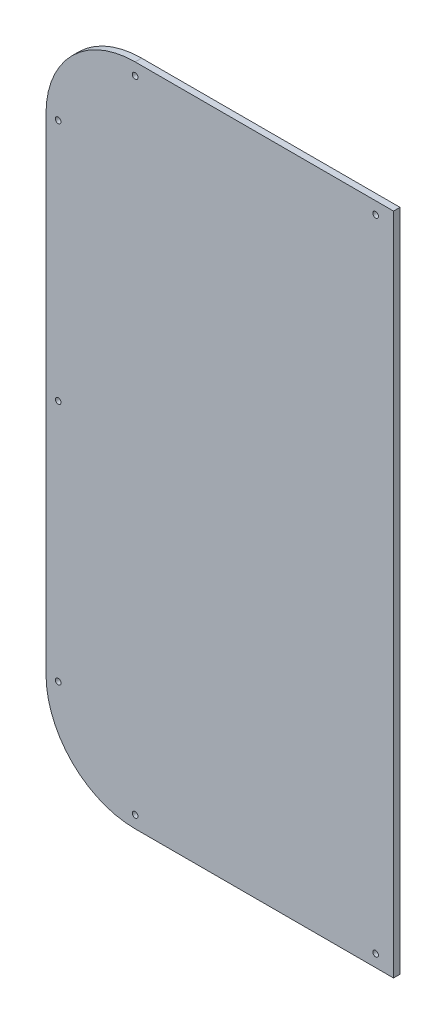
ISO-10303-21;
HEADER;
FILE_DESCRIPTION(('STEP AP214'),'2;1');
FILE_NAME('part.step','',(''),(''),'','','');
FILE_SCHEMA(('AUTOMOTIVE_DESIGN { 1 0 10303 214 1 1 1 1 }'));
ENDSEC;
DATA;
#1=APPLICATION_CONTEXT('core data for automotive mechanical design processes');
#2=APPLICATION_PROTOCOL_DEFINITION('international standard','automotive_design',2000,#1);
#3=PRODUCT_CONTEXT('',#1,'mechanical');
#4=PRODUCT('Part','Part','',(#3));
#5=PRODUCT_RELATED_PRODUCT_CATEGORY('part','',(#4));
#6=PRODUCT_DEFINITION_FORMATION('','',#4);
#7=PRODUCT_DEFINITION_CONTEXT('part definition',#1,'design');
#8=PRODUCT_DEFINITION('design','',#6,#7);
#9=PRODUCT_DEFINITION_SHAPE('','',#8);
#10=(LENGTH_UNIT() NAMED_UNIT(*) SI_UNIT(.MILLI.,.METRE.));
#11=(NAMED_UNIT(*) PLANE_ANGLE_UNIT() SI_UNIT($,.RADIAN.));
#12=(NAMED_UNIT(*) SI_UNIT($,.STERADIAN.) SOLID_ANGLE_UNIT());
#13=UNCERTAINTY_MEASURE_WITH_UNIT(LENGTH_MEASURE(1.E-05),#10,'distance_accuracy_value','');
#14=(GEOMETRIC_REPRESENTATION_CONTEXT(3) GLOBAL_UNCERTAINTY_ASSIGNED_CONTEXT((#13)) GLOBAL_UNIT_ASSIGNED_CONTEXT((#10,
#11,#12)) REPRESENTATION_CONTEXT('',''));
#15=CARTESIAN_POINT('',(0.,0.,0.));
#16=DIRECTION('',(0.,0.,1.));
#17=DIRECTION('',(1.,0.,0.));
#18=AXIS2_PLACEMENT_3D('',#15,#16,#17);
#19=CARTESIAN_POINT('',(1864.32169988616,36.4488461921758,4.));
#20=DIRECTION('',(0.,0.,1.));
#21=DIRECTION('',(1.,0.,0.));
#22=AXIS2_PLACEMENT_3D('',#19,#20,#21);
#23=PLANE('',#22);
#24=CARTESIAN_POINT('',(1864.32169988616,383.948846192176,4.));
#25=DIRECTION('',(0.,0.,1.));
#26=DIRECTION('',(1.,0.,0.));
#27=AXIS2_PLACEMENT_3D('',#24,#25,#26);
#28=CIRCLE('',#27,1.74999999999988);
#29=CARTESIAN_POINT('',(1866.07169988616,383.948846192176,4.));
#30=VERTEX_POINT('',#29);
#31=EDGE_CURVE('E202',#30,#30,#28,.T.);
#32=ORIENTED_EDGE('',*,*,#31,.F.);
#33=EDGE_LOOP('',(#32));
#34=FACE_BOUND('',#33,.T.);
#35=CARTESIAN_POINT('',(1816.82169988616,186.448846192176,4.));
#36=DIRECTION('',(0.,0.,1.));
#37=DIRECTION('',(1.,0.,0.));
#38=AXIS2_PLACEMENT_3D('',#35,#36,#37);
#39=CIRCLE('',#38,1.74999999999987);
#40=CARTESIAN_POINT('',(1818.57169988616,186.448846192176,4.));
#41=VERTEX_POINT('',#40);
#42=EDGE_CURVE('E214',#41,#41,#39,.T.);
#43=ORIENTED_EDGE('',*,*,#42,.F.);
#44=EDGE_LOOP('',(#43));
#45=FACE_BOUND('',#44,.T.);
#46=CARTESIAN_POINT('',(1864.32169988616,-11.0511538078242,4.));
#47=DIRECTION('',(0.,0.,1.));
#48=DIRECTION('',(1.,0.,0.));
#49=AXIS2_PLACEMENT_3D('',#46,#47,#48);
#50=CIRCLE('',#49,1.74999999999987);
#51=CARTESIAN_POINT('',(1866.07169988616,-11.0511538078242,4.));
#52=VERTEX_POINT('',#51);
#53=EDGE_CURVE('E226',#52,#52,#50,.T.);
#54=ORIENTED_EDGE('',*,*,#53,.F.);
#55=EDGE_LOOP('',(#54));
#56=FACE_BOUND('',#55,.T.);
#57=CARTESIAN_POINT('',(1864.32169988616,36.4488461921758,4.));
#58=DIRECTION('',(0.,0.,1.));
#59=DIRECTION('',(1.,0.,0.));
#60=AXIS2_PLACEMENT_3D('',#57,#58,#59);
#61=CIRCLE('',#60,55.);
#62=CARTESIAN_POINT('',(1809.32169988616,36.4488461921758,4.));
#63=VERTEX_POINT('',#62);
#64=CARTESIAN_POINT('',(1864.32169988616,-18.5511538078242,4.));
#65=VERTEX_POINT('',#64);
#66=EDGE_CURVE('E129',#63,#65,#61,.T.);
#67=ORIENTED_EDGE('',*,*,#66,.T.);
#68=DIRECTION('',(1.,0.,0.));
#69=VECTOR('',#68,1.);
#70=CARTESIAN_POINT('',(1864.32169988616,-18.5511538078242,4.));
#71=LINE('',#70,#69);
#72=CARTESIAN_POINT('',(2023.82169988616,-18.5511538078242,4.));
#73=VERTEX_POINT('',#72);
#74=EDGE_CURVE('E87',#65,#73,#71,.T.);
#75=ORIENTED_EDGE('',*,*,#74,.T.);
#76=DIRECTION('',(0.,1.,0.));
#77=VECTOR('',#76,1.);
#78=CARTESIAN_POINT('',(2023.82169988616,391.448846192176,4.));
#79=LINE('',#78,#77);
#80=CARTESIAN_POINT('',(2023.82169988616,391.448846192176,4.));
#81=VERTEX_POINT('',#80);
#82=EDGE_CURVE('E100',#73,#81,#79,.T.);
#83=ORIENTED_EDGE('',*,*,#82,.T.);
#84=DIRECTION('',(-1.,0.,0.));
#85=VECTOR('',#84,1.);
#86=CARTESIAN_POINT('',(2023.82169988616,391.448846192176,4.));
#87=LINE('',#86,#85);
#88=CARTESIAN_POINT('',(1864.32169988616,391.448846192176,4.));
#89=VERTEX_POINT('',#88);
#90=EDGE_CURVE('E94',#81,#89,#87,.T.);
#91=ORIENTED_EDGE('',*,*,#90,.T.);
#92=CARTESIAN_POINT('',(1864.32169988616,336.448846192176,4.));
#93=DIRECTION('',(0.,0.,1.));
#94=DIRECTION('',(1.,0.,0.));
#95=AXIS2_PLACEMENT_3D('',#92,#93,#94);
#96=CIRCLE('',#95,55.);
#97=CARTESIAN_POINT('',(1809.32169988616,336.448846192176,4.));
#98=VERTEX_POINT('',#97);
#99=EDGE_CURVE('E98',#89,#98,#96,.T.);
#100=ORIENTED_EDGE('',*,*,#99,.T.);
#101=DIRECTION('',(0.,-1.,0.));
#102=VECTOR('',#101,1.);
#103=CARTESIAN_POINT('',(1809.32169988616,336.448846192176,4.));
#104=LINE('',#103,#102);
#105=EDGE_CURVE('E50',#98,#63,#104,.T.);
#106=ORIENTED_EDGE('',*,*,#105,.T.);
#107=EDGE_LOOP('',(#67,#75,#83,#91,#100,#106));
#108=FACE_BOUND('',#107,.T.);
#109=CARTESIAN_POINT('',(2012.76292797969,-11.0511538078242,4.));
#110=DIRECTION('',(0.,0.,1.));
#111=DIRECTION('',(1.,0.,0.));
#112=AXIS2_PLACEMENT_3D('',#109,#110,#111);
#113=CIRCLE('',#112,1.75000000000008);
#114=CARTESIAN_POINT('',(2014.51292797969,-11.0511538078242,4.));
#115=VERTEX_POINT('',#114);
#116=EDGE_CURVE('E122',#115,#115,#113,.T.);
#117=ORIENTED_EDGE('',*,*,#116,.F.);
#118=EDGE_LOOP('',(#117));
#119=FACE_BOUND('',#118,.T.);
#120=CARTESIAN_POINT('',(1816.82169988616,36.4488461921758,4.));
#121=DIRECTION('',(0.,0.,1.));
#122=DIRECTION('',(1.,0.,0.));
#123=AXIS2_PLACEMENT_3D('',#120,#121,#122);
#124=CIRCLE('',#123,1.74999999999987);
#125=CARTESIAN_POINT('',(1818.57169988616,36.4488461921758,4.));
#126=VERTEX_POINT('',#125);
#127=EDGE_CURVE('E220',#126,#126,#124,.T.);
#128=ORIENTED_EDGE('',*,*,#127,.F.);
#129=EDGE_LOOP('',(#128));
#130=FACE_BOUND('',#129,.T.);
#131=CARTESIAN_POINT('',(1816.82169988616,336.448846192176,4.));
#132=DIRECTION('',(0.,0.,1.));
#133=DIRECTION('',(1.,0.,0.));
#134=AXIS2_PLACEMENT_3D('',#131,#132,#133);
#135=CIRCLE('',#134,1.74999999999988);
#136=CARTESIAN_POINT('',(1818.57169988616,336.448846192176,4.));
#137=VERTEX_POINT('',#136);
#138=EDGE_CURVE('E208',#137,#137,#135,.T.);
#139=ORIENTED_EDGE('',*,*,#138,.F.);
#140=EDGE_LOOP('',(#139));
#141=FACE_BOUND('',#140,.T.);
#142=CARTESIAN_POINT('',(2012.76292797969,383.948846192176,4.));
#143=DIRECTION('',(0.,0.,1.));
#144=DIRECTION('',(1.,0.,0.));
#145=AXIS2_PLACEMENT_3D('',#142,#143,#144);
#146=CIRCLE('',#145,1.75000000000009);
#147=CARTESIAN_POINT('',(2014.51292797969,383.948846192176,4.));
#148=VERTEX_POINT('',#147);
#149=EDGE_CURVE('E193',#148,#148,#146,.T.);
#150=ORIENTED_EDGE('',*,*,#149,.F.);
#151=EDGE_LOOP('',(#150));
#152=FACE_BOUND('',#151,.T.);
#153=ADVANCED_FACE('F33',(#34,#45,#56,#108,#119,#130,#141,#152),#23,.T.);
#154=CARTESIAN_POINT('',(1864.32169988616,36.4488461921758,0.));
#155=DIRECTION('',(0.,0.,1.));
#156=DIRECTION('',(1.,0.,0.));
#157=AXIS2_PLACEMENT_3D('',#154,#155,#156);
#158=PLANE('',#157);
#159=CARTESIAN_POINT('',(1864.32169988616,383.948846192176,0.));
#160=DIRECTION('',(0.,0.,1.));
#161=DIRECTION('',(1.,0.,0.));
#162=AXIS2_PLACEMENT_3D('',#159,#160,#161);
#163=CIRCLE('',#162,1.74999999999988);
#164=CARTESIAN_POINT('',(1866.07169988616,383.948846192176,0.));
#165=VERTEX_POINT('',#164);
#166=EDGE_CURVE('E199',#165,#165,#163,.T.);
#167=ORIENTED_EDGE('',*,*,#166,.T.);
#168=EDGE_LOOP('',(#167));
#169=FACE_BOUND('',#168,.T.);
#170=CARTESIAN_POINT('',(1816.82169988616,186.448846192176,0.));
#171=DIRECTION('',(0.,0.,1.));
#172=DIRECTION('',(1.,0.,0.));
#173=AXIS2_PLACEMENT_3D('',#170,#171,#172);
#174=CIRCLE('',#173,1.74999999999987);
#175=CARTESIAN_POINT('',(1818.57169988616,186.448846192176,0.));
#176=VERTEX_POINT('',#175);
#177=EDGE_CURVE('E211',#176,#176,#174,.T.);
#178=ORIENTED_EDGE('',*,*,#177,.T.);
#179=EDGE_LOOP('',(#178));
#180=FACE_BOUND('',#179,.T.);
#181=CARTESIAN_POINT('',(1864.32169988616,-11.0511538078242,0.));
#182=DIRECTION('',(0.,0.,1.));
#183=DIRECTION('',(1.,0.,0.));
#184=AXIS2_PLACEMENT_3D('',#181,#182,#183);
#185=CIRCLE('',#184,1.74999999999987);
#186=CARTESIAN_POINT('',(1866.07169988616,-11.0511538078242,0.));
#187=VERTEX_POINT('',#186);
#188=EDGE_CURVE('E223',#187,#187,#185,.T.);
#189=ORIENTED_EDGE('',*,*,#188,.T.);
#190=EDGE_LOOP('',(#189));
#191=FACE_BOUND('',#190,.T.);
#192=CARTESIAN_POINT('',(1864.32169988616,36.4488461921758,0.));
#193=DIRECTION('',(0.,0.,1.));
#194=DIRECTION('',(1.,0.,0.));
#195=AXIS2_PLACEMENT_3D('',#192,#193,#194);
#196=CIRCLE('',#195,55.);
#197=CARTESIAN_POINT('',(1809.32169988616,36.4488461921758,0.));
#198=VERTEX_POINT('',#197);
#199=CARTESIAN_POINT('',(1864.32169988616,-18.5511538078242,0.));
#200=VERTEX_POINT('',#199);
#201=EDGE_CURVE('E118',#198,#200,#196,.T.);
#202=ORIENTED_EDGE('',*,*,#201,.F.);
#203=DIRECTION('',(0.,-1.,0.));
#204=VECTOR('',#203,1.);
#205=CARTESIAN_POINT('',(1809.32169988616,336.448846192176,0.));
#206=LINE('',#205,#204);
#207=CARTESIAN_POINT('',(1809.32169988616,336.448846192176,0.));
#208=VERTEX_POINT('',#207);
#209=EDGE_CURVE('E79',#208,#198,#206,.T.);
#210=ORIENTED_EDGE('',*,*,#209,.F.);
#211=CARTESIAN_POINT('',(1864.32169988616,336.448846192176,0.));
#212=DIRECTION('',(0.,0.,1.));
#213=DIRECTION('',(1.,0.,0.));
#214=AXIS2_PLACEMENT_3D('',#211,#212,#213);
#215=CIRCLE('',#214,55.);
#216=CARTESIAN_POINT('',(1864.32169988616,391.448846192176,0.));
#217=VERTEX_POINT('',#216);
#218=EDGE_CURVE('E73',#217,#208,#215,.T.);
#219=ORIENTED_EDGE('',*,*,#218,.F.);
#220=DIRECTION('',(-1.,0.,0.));
#221=VECTOR('',#220,1.);
#222=CARTESIAN_POINT('',(2023.82169988616,391.448846192176,0.));
#223=LINE('',#222,#221);
#224=CARTESIAN_POINT('',(2023.82169988616,391.448846192176,0.));
#225=VERTEX_POINT('',#224);
#226=EDGE_CURVE('E108',#225,#217,#223,.T.);
#227=ORIENTED_EDGE('',*,*,#226,.F.);
#228=DIRECTION('',(0.,1.,0.));
#229=VECTOR('',#228,1.);
#230=CARTESIAN_POINT('',(2023.82169988616,391.448846192176,0.));
#231=LINE('',#230,#229);
#232=CARTESIAN_POINT('',(2023.82169988616,-18.5511538078242,0.));
#233=VERTEX_POINT('',#232);
#234=EDGE_CURVE('E124',#233,#225,#231,.T.);
#235=ORIENTED_EDGE('',*,*,#234,.F.);
#236=DIRECTION('',(1.,0.,0.));
#237=VECTOR('',#236,1.);
#238=CARTESIAN_POINT('',(1864.32169988616,-18.5511538078242,0.));
#239=LINE('',#238,#237);
#240=EDGE_CURVE('E121',#200,#233,#239,.T.);
#241=ORIENTED_EDGE('',*,*,#240,.F.);
#242=EDGE_LOOP('',(#202,#210,#219,#227,#235,#241));
#243=FACE_BOUND('',#242,.T.);
#244=CARTESIAN_POINT('',(2012.76292797969,-11.0511538078242,0.));
#245=DIRECTION('',(0.,0.,1.));
#246=DIRECTION('',(1.,0.,0.));
#247=AXIS2_PLACEMENT_3D('',#244,#245,#246);
#248=CIRCLE('',#247,1.75000000000008);
#249=CARTESIAN_POINT('',(2014.51292797969,-11.0511538078242,0.));
#250=VERTEX_POINT('',#249);
#251=EDGE_CURVE('E229',#250,#250,#248,.T.);
#252=ORIENTED_EDGE('',*,*,#251,.T.);
#253=EDGE_LOOP('',(#252));
#254=FACE_BOUND('',#253,.T.);
#255=CARTESIAN_POINT('',(1816.82169988616,36.4488461921758,0.));
#256=DIRECTION('',(0.,0.,1.));
#257=DIRECTION('',(1.,0.,0.));
#258=AXIS2_PLACEMENT_3D('',#255,#256,#257);
#259=CIRCLE('',#258,1.74999999999987);
#260=CARTESIAN_POINT('',(1818.57169988616,36.4488461921758,0.));
#261=VERTEX_POINT('',#260);
#262=EDGE_CURVE('E217',#261,#261,#259,.T.);
#263=ORIENTED_EDGE('',*,*,#262,.T.);
#264=EDGE_LOOP('',(#263));
#265=FACE_BOUND('',#264,.T.);
#266=CARTESIAN_POINT('',(1816.82169988616,336.448846192176,0.));
#267=DIRECTION('',(0.,0.,1.));
#268=DIRECTION('',(1.,0.,0.));
#269=AXIS2_PLACEMENT_3D('',#266,#267,#268);
#270=CIRCLE('',#269,1.74999999999988);
#271=CARTESIAN_POINT('',(1818.57169988616,336.448846192176,0.));
#272=VERTEX_POINT('',#271);
#273=EDGE_CURVE('E205',#272,#272,#270,.T.);
#274=ORIENTED_EDGE('',*,*,#273,.T.);
#275=EDGE_LOOP('',(#274));
#276=FACE_BOUND('',#275,.T.);
#277=CARTESIAN_POINT('',(2012.76292797969,383.948846192176,0.));
#278=DIRECTION('',(0.,0.,1.));
#279=DIRECTION('',(1.,0.,0.));
#280=AXIS2_PLACEMENT_3D('',#277,#278,#279);
#281=CIRCLE('',#280,1.75000000000009);
#282=CARTESIAN_POINT('',(2014.51292797969,383.948846192176,0.));
#283=VERTEX_POINT('',#282);
#284=EDGE_CURVE('E196',#283,#283,#281,.T.);
#285=ORIENTED_EDGE('',*,*,#284,.T.);
#286=EDGE_LOOP('',(#285));
#287=FACE_BOUND('',#286,.T.);
#288=ADVANCED_FACE('F138',(#169,#180,#191,#243,#254,#265,#276,#287),#158,.F.);
#289=CARTESIAN_POINT('',(1864.32169988616,36.4488461921758,4.));
#290=DIRECTION('',(0.,0.,-1.));
#291=DIRECTION('',(-1.,0.,0.));
#292=AXIS2_PLACEMENT_3D('',#289,#290,#291);
#293=CYLINDRICAL_SURFACE('',#292,55.);
#294=ORIENTED_EDGE('',*,*,#201,.T.);
#295=DIRECTION('',(0.,0.,-1.));
#296=VECTOR('',#295,1.);
#297=CARTESIAN_POINT('',(1864.32169988616,-18.5511538078242,4.));
#298=LINE('',#297,#296);
#299=EDGE_CURVE('E11',#65,#200,#298,.T.);
#300=ORIENTED_EDGE('',*,*,#299,.F.);
#301=ORIENTED_EDGE('',*,*,#66,.F.);
#302=DIRECTION('',(0.,0.,-1.));
#303=VECTOR('',#302,1.);
#304=CARTESIAN_POINT('',(1809.32169988616,36.4488461921758,4.));
#305=LINE('',#304,#303);
#306=EDGE_CURVE('E114',#63,#198,#305,.T.);
#307=ORIENTED_EDGE('',*,*,#306,.T.);
#308=EDGE_LOOP('',(#294,#300,#301,#307));
#309=FACE_BOUND('',#308,.T.);
#310=ADVANCED_FACE('F35',(#309),#293,.T.);
#311=CARTESIAN_POINT('',(1864.32169988616,-18.5511538078242,4.));
#312=DIRECTION('',(0.,1.,0.));
#313=DIRECTION('',(0.,0.,1.));
#314=AXIS2_PLACEMENT_3D('',#311,#312,#313);
#315=PLANE('',#314);
#316=ORIENTED_EDGE('',*,*,#240,.T.);
#317=DIRECTION('',(0.,0.,-1.));
#318=VECTOR('',#317,1.);
#319=CARTESIAN_POINT('',(2023.82169988616,-18.5511538078242,4.));
#320=LINE('',#319,#318);
#321=EDGE_CURVE('E42',#73,#233,#320,.T.);
#322=ORIENTED_EDGE('',*,*,#321,.F.);
#323=ORIENTED_EDGE('',*,*,#74,.F.);
#324=ORIENTED_EDGE('',*,*,#299,.T.);
#325=EDGE_LOOP('',(#316,#322,#323,#324));
#326=FACE_BOUND('',#325,.T.);
#327=ADVANCED_FACE('F313',(#326),#315,.F.);
#328=CARTESIAN_POINT('',(2023.82169988616,391.448846192176,4.));
#329=DIRECTION('',(-1.,0.,0.));
#330=DIRECTION('',(0.,-1.,0.));
#331=AXIS2_PLACEMENT_3D('',#328,#329,#330);
#332=PLANE('',#331);
#333=ORIENTED_EDGE('',*,*,#234,.T.);
#334=DIRECTION('',(0.,0.,-1.));
#335=VECTOR('',#334,1.);
#336=CARTESIAN_POINT('',(2023.82169988616,391.448846192176,4.));
#337=LINE('',#336,#335);
#338=EDGE_CURVE('E109',#81,#225,#337,.T.);
#339=ORIENTED_EDGE('',*,*,#338,.F.);
#340=ORIENTED_EDGE('',*,*,#82,.F.);
#341=ORIENTED_EDGE('',*,*,#321,.T.);
#342=EDGE_LOOP('',(#333,#339,#340,#341));
#343=FACE_BOUND('',#342,.T.);
#344=ADVANCED_FACE('F135',(#343),#332,.F.);
#345=CARTESIAN_POINT('',(2023.82169988616,391.448846192176,4.));
#346=DIRECTION('',(0.,-1.,0.));
#347=DIRECTION('',(0.,0.,-1.));
#348=AXIS2_PLACEMENT_3D('',#345,#346,#347);
#349=PLANE('',#348);
#350=ORIENTED_EDGE('',*,*,#226,.T.);
#351=DIRECTION('',(0.,0.,-1.));
#352=VECTOR('',#351,1.);
#353=CARTESIAN_POINT('',(1864.32169988616,391.448846192176,4.));
#354=LINE('',#353,#352);
#355=EDGE_CURVE('E105',#89,#217,#354,.T.);
#356=ORIENTED_EDGE('',*,*,#355,.F.);
#357=ORIENTED_EDGE('',*,*,#90,.F.);
#358=ORIENTED_EDGE('',*,*,#338,.T.);
#359=EDGE_LOOP('',(#350,#356,#357,#358));
#360=FACE_BOUND('',#359,.T.);
#361=ADVANCED_FACE('F106',(#360),#349,.F.);
#362=CARTESIAN_POINT('',(1864.32169988616,336.448846192176,4.));
#363=DIRECTION('',(0.,0.,-1.));
#364=DIRECTION('',(-1.,0.,0.));
#365=AXIS2_PLACEMENT_3D('',#362,#363,#364);
#366=CYLINDRICAL_SURFACE('',#365,55.);
#367=ORIENTED_EDGE('',*,*,#218,.T.);
#368=DIRECTION('',(0.,0.,-1.));
#369=VECTOR('',#368,1.);
#370=CARTESIAN_POINT('',(1809.32169988616,336.448846192176,4.));
#371=LINE('',#370,#369);
#372=EDGE_CURVE('E110',#98,#208,#371,.T.);
#373=ORIENTED_EDGE('',*,*,#372,.F.);
#374=ORIENTED_EDGE('',*,*,#99,.F.);
#375=ORIENTED_EDGE('',*,*,#355,.T.);
#376=EDGE_LOOP('',(#367,#373,#374,#375));
#377=FACE_BOUND('',#376,.T.);
#378=ADVANCED_FACE('F112',(#377),#366,.T.);
#379=CARTESIAN_POINT('',(1809.32169988616,336.448846192176,4.));
#380=DIRECTION('',(1.,0.,0.));
#381=DIRECTION('',(0.,0.,-1.));
#382=AXIS2_PLACEMENT_3D('',#379,#380,#381);
#383=PLANE('',#382);
#384=ORIENTED_EDGE('',*,*,#209,.T.);
#385=ORIENTED_EDGE('',*,*,#306,.F.);
#386=ORIENTED_EDGE('',*,*,#105,.F.);
#387=ORIENTED_EDGE('',*,*,#372,.T.);
#388=EDGE_LOOP('',(#384,#385,#386,#387));
#389=FACE_BOUND('',#388,.T.);
#390=ADVANCED_FACE('F143',(#389),#383,.F.);
#391=CARTESIAN_POINT('',(2012.76292797969,-11.0511538078242,4.));
#392=DIRECTION('',(0.,0.,-1.));
#393=DIRECTION('',(-1.,0.,0.));
#394=AXIS2_PLACEMENT_3D('',#391,#392,#393);
#395=CYLINDRICAL_SURFACE('',#394,1.75000000000008);
#396=ORIENTED_EDGE('',*,*,#116,.T.);
#397=EDGE_LOOP('',(#396));
#398=FACE_BOUND('',#397,.T.);
#399=ORIENTED_EDGE('',*,*,#251,.F.);
#400=EDGE_LOOP('',(#399));
#401=FACE_BOUND('',#400,.T.);
#402=ADVANCED_FACE('F145',(#398,#401),#395,.F.);
#403=CARTESIAN_POINT('',(1864.32169988616,-11.0511538078242,4.));
#404=DIRECTION('',(0.,0.,-1.));
#405=DIRECTION('',(-1.,0.,0.));
#406=AXIS2_PLACEMENT_3D('',#403,#404,#405);
#407=CYLINDRICAL_SURFACE('',#406,1.74999999999987);
#408=ORIENTED_EDGE('',*,*,#53,.T.);
#409=EDGE_LOOP('',(#408));
#410=FACE_BOUND('',#409,.T.);
#411=ORIENTED_EDGE('',*,*,#188,.F.);
#412=EDGE_LOOP('',(#411));
#413=FACE_BOUND('',#412,.T.);
#414=ADVANCED_FACE('F151',(#410,#413),#407,.F.);
#415=CARTESIAN_POINT('',(1816.82169988616,36.4488461921758,4.));
#416=DIRECTION('',(0.,0.,-1.));
#417=DIRECTION('',(-1.,0.,0.));
#418=AXIS2_PLACEMENT_3D('',#415,#416,#417);
#419=CYLINDRICAL_SURFACE('',#418,1.74999999999987);
#420=ORIENTED_EDGE('',*,*,#127,.T.);
#421=EDGE_LOOP('',(#420));
#422=FACE_BOUND('',#421,.T.);
#423=ORIENTED_EDGE('',*,*,#262,.F.);
#424=EDGE_LOOP('',(#423));
#425=FACE_BOUND('',#424,.T.);
#426=ADVANCED_FACE('F168',(#422,#425),#419,.F.);
#427=CARTESIAN_POINT('',(1816.82169988616,186.448846192176,4.));
#428=DIRECTION('',(0.,0.,-1.));
#429=DIRECTION('',(-1.,0.,0.));
#430=AXIS2_PLACEMENT_3D('',#427,#428,#429);
#431=CYLINDRICAL_SURFACE('',#430,1.74999999999987);
#432=ORIENTED_EDGE('',*,*,#42,.T.);
#433=EDGE_LOOP('',(#432));
#434=FACE_BOUND('',#433,.T.);
#435=ORIENTED_EDGE('',*,*,#177,.F.);
#436=EDGE_LOOP('',(#435));
#437=FACE_BOUND('',#436,.T.);
#438=ADVANCED_FACE('F172',(#434,#437),#431,.F.);
#439=CARTESIAN_POINT('',(1816.82169988616,336.448846192176,4.));
#440=DIRECTION('',(0.,0.,-1.));
#441=DIRECTION('',(-1.,0.,0.));
#442=AXIS2_PLACEMENT_3D('',#439,#440,#441);
#443=CYLINDRICAL_SURFACE('',#442,1.74999999999988);
#444=ORIENTED_EDGE('',*,*,#138,.T.);
#445=EDGE_LOOP('',(#444));
#446=FACE_BOUND('',#445,.T.);
#447=ORIENTED_EDGE('',*,*,#273,.F.);
#448=EDGE_LOOP('',(#447));
#449=FACE_BOUND('',#448,.T.);
#450=ADVANCED_FACE('F176',(#446,#449),#443,.F.);
#451=CARTESIAN_POINT('',(1864.32169988616,383.948846192176,4.));
#452=DIRECTION('',(0.,0.,-1.));
#453=DIRECTION('',(-1.,0.,0.));
#454=AXIS2_PLACEMENT_3D('',#451,#452,#453);
#455=CYLINDRICAL_SURFACE('',#454,1.74999999999988);
#456=ORIENTED_EDGE('',*,*,#31,.T.);
#457=EDGE_LOOP('',(#456));
#458=FACE_BOUND('',#457,.T.);
#459=ORIENTED_EDGE('',*,*,#166,.F.);
#460=EDGE_LOOP('',(#459));
#461=FACE_BOUND('',#460,.T.);
#462=ADVANCED_FACE('F180',(#458,#461),#455,.F.);
#463=CARTESIAN_POINT('',(2012.76292797969,383.948846192176,4.));
#464=DIRECTION('',(0.,0.,-1.));
#465=DIRECTION('',(-1.,0.,0.));
#466=AXIS2_PLACEMENT_3D('',#463,#464,#465);
#467=CYLINDRICAL_SURFACE('',#466,1.75000000000009);
#468=ORIENTED_EDGE('',*,*,#149,.T.);
#469=EDGE_LOOP('',(#468));
#470=FACE_BOUND('',#469,.T.);
#471=ORIENTED_EDGE('',*,*,#284,.F.);
#472=EDGE_LOOP('',(#471));
#473=FACE_BOUND('',#472,.T.);
#474=ADVANCED_FACE('F184',(#470,#473),#467,.F.);
#475=CLOSED_SHELL('',(#153,#288,#310,#327,#344,#361,#378,#390,#402,#414,#426,#438,#450,#462,#474));
#476=MANIFOLD_SOLID_BREP('B2',#475);
#477=ADVANCED_BREP_SHAPE_REPRESENTATION('',(#18,#476),#14);
#478=SHAPE_DEFINITION_REPRESENTATION(#9,#477);
ENDSEC;
END-ISO-10303-21;
